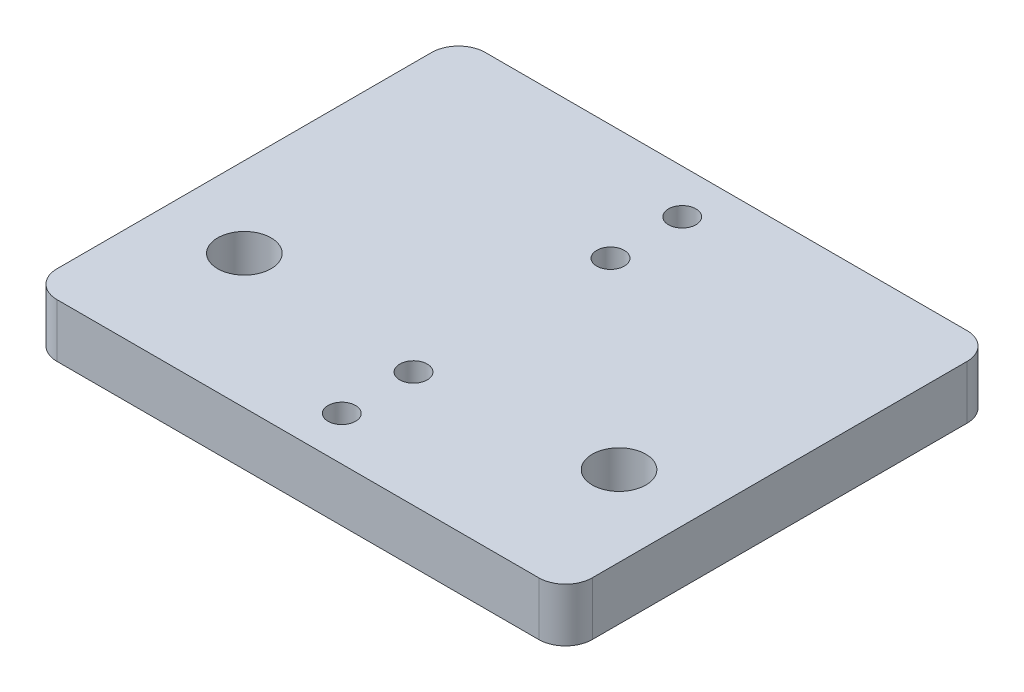
ISO-10303-21;
HEADER;
FILE_DESCRIPTION(('STEP AP214'),'2;1');
FILE_NAME('part.step','',(''),(''),'','','');
FILE_SCHEMA(('AUTOMOTIVE_DESIGN { 1 0 10303 214 1 1 1 1 }'));
ENDSEC;
DATA;
#1=APPLICATION_CONTEXT('core data for automotive mechanical design processes');
#2=APPLICATION_PROTOCOL_DEFINITION('international standard','automotive_design',2000,#1);
#3=PRODUCT_CONTEXT('',#1,'mechanical');
#4=PRODUCT('Part','Part','',(#3));
#5=PRODUCT_RELATED_PRODUCT_CATEGORY('part','',(#4));
#6=PRODUCT_DEFINITION_FORMATION('','',#4);
#7=PRODUCT_DEFINITION_CONTEXT('part definition',#1,'design');
#8=PRODUCT_DEFINITION('design','',#6,#7);
#9=PRODUCT_DEFINITION_SHAPE('','',#8);
#10=(LENGTH_UNIT() NAMED_UNIT(*) SI_UNIT(.MILLI.,.METRE.));
#11=(NAMED_UNIT(*) PLANE_ANGLE_UNIT() SI_UNIT($,.RADIAN.));
#12=(NAMED_UNIT(*) SI_UNIT($,.STERADIAN.) SOLID_ANGLE_UNIT());
#13=UNCERTAINTY_MEASURE_WITH_UNIT(LENGTH_MEASURE(1.E-05),#10,'distance_accuracy_value','');
#14=(GEOMETRIC_REPRESENTATION_CONTEXT(3) GLOBAL_UNCERTAINTY_ASSIGNED_CONTEXT((#13)) GLOBAL_UNIT_ASSIGNED_CONTEXT((#10,
#11,#12)) REPRESENTATION_CONTEXT('',''));
#15=CARTESIAN_POINT('',(0.,0.,0.));
#16=DIRECTION('',(0.,0.,1.));
#17=DIRECTION('',(1.,0.,0.));
#18=AXIS2_PLACEMENT_3D('',#15,#16,#17);
#19=CARTESIAN_POINT('',(0.,6.35,0.));
#20=DIRECTION('',(0.,-1.,0.));
#21=DIRECTION('',(0.,0.,-1.));
#22=AXIS2_PLACEMENT_3D('',#19,#20,#21);
#23=PLANE('',#22);
#24=DIRECTION('',(-1.,0.,0.));
#25=VECTOR('',#24,1.);
#26=CARTESIAN_POINT('',(-63.5,6.35,-50.8));
#27=LINE('',#26,#25);
#28=CARTESIAN_POINT('',(57.15,6.35,-50.8));
#29=VERTEX_POINT('',#28);
#30=CARTESIAN_POINT('',(-57.15,6.35,-50.8));
#31=VERTEX_POINT('',#30);
#32=EDGE_CURVE('E168',#29,#31,#27,.T.);
#33=ORIENTED_EDGE('',*,*,#32,.T.);
#34=CARTESIAN_POINT('',(-57.15,6.35,-44.45));
#35=DIRECTION('',(0.,-1.,0.));
#36=DIRECTION('',(0.,0.,-1.));
#37=AXIS2_PLACEMENT_3D('',#34,#35,#36);
#38=CIRCLE('',#37,6.35);
#39=CARTESIAN_POINT('',(-63.5,6.35,-44.45));
#40=VERTEX_POINT('',#39);
#41=EDGE_CURVE('E146',#31,#40,#38,.F.);
#42=ORIENTED_EDGE('',*,*,#41,.T.);
#43=DIRECTION('',(0.,0.,1.));
#44=VECTOR('',#43,1.);
#45=CARTESIAN_POINT('',(-63.5,6.35,50.8));
#46=LINE('',#45,#44);
#47=CARTESIAN_POINT('',(-63.5,6.35,44.45));
#48=VERTEX_POINT('',#47);
#49=EDGE_CURVE('E116',#40,#48,#46,.T.);
#50=ORIENTED_EDGE('',*,*,#49,.T.);
#51=CARTESIAN_POINT('',(-57.15,6.35,44.45));
#52=DIRECTION('',(0.,-1.,0.));
#53=DIRECTION('',(0.,0.,-1.));
#54=AXIS2_PLACEMENT_3D('',#51,#52,#53);
#55=CIRCLE('',#54,6.35);
#56=CARTESIAN_POINT('',(-57.15,6.35,50.8));
#57=VERTEX_POINT('',#56);
#58=EDGE_CURVE('E52',#48,#57,#55,.F.);
#59=ORIENTED_EDGE('',*,*,#58,.T.);
#60=DIRECTION('',(1.,0.,0.));
#61=VECTOR('',#60,1.);
#62=CARTESIAN_POINT('',(-63.5,6.35,50.8));
#63=LINE('',#62,#61);
#64=CARTESIAN_POINT('',(57.1499999999999,6.35,50.8));
#65=VERTEX_POINT('',#64);
#66=EDGE_CURVE('E132',#57,#65,#63,.T.);
#67=ORIENTED_EDGE('',*,*,#66,.T.);
#68=CARTESIAN_POINT('',(57.15,6.35,44.45));
#69=DIRECTION('',(0.,-1.,0.));
#70=DIRECTION('',(0.,0.,-1.));
#71=AXIS2_PLACEMENT_3D('',#68,#69,#70);
#72=CIRCLE('',#71,6.35);
#73=CARTESIAN_POINT('',(63.5,6.35,44.45));
#74=VERTEX_POINT('',#73);
#75=EDGE_CURVE('E142',#65,#74,#72,.F.);
#76=ORIENTED_EDGE('',*,*,#75,.T.);
#77=DIRECTION('',(0.,0.,-1.));
#78=VECTOR('',#77,1.);
#79=CARTESIAN_POINT('',(63.5,6.35,50.8));
#80=LINE('',#79,#78);
#81=CARTESIAN_POINT('',(63.5,6.35,-44.45));
#82=VERTEX_POINT('',#81);
#83=EDGE_CURVE('E126',#74,#82,#80,.T.);
#84=ORIENTED_EDGE('',*,*,#83,.T.);
#85=CARTESIAN_POINT('',(57.15,6.35,-44.45));
#86=DIRECTION('',(0.,-1.,0.));
#87=DIRECTION('',(0.,0.,-1.));
#88=AXIS2_PLACEMENT_3D('',#85,#86,#87);
#89=CIRCLE('',#88,6.35);
#90=EDGE_CURVE('E144',#82,#29,#89,.F.);
#91=ORIENTED_EDGE('',*,*,#90,.T.);
#92=EDGE_LOOP('',(#33,#42,#50,#59,#67,#76,#84,#91));
#93=FACE_BOUND('',#92,.T.);
#94=CARTESIAN_POINT('',(0.,6.35,-23.368));
#95=DIRECTION('',(0.,1.,0.));
#96=DIRECTION('',(0.,0.,1.));
#97=AXIS2_PLACEMENT_3D('',#94,#95,#96);
#98=CIRCLE('',#97,3.2639);
#99=CARTESIAN_POINT('',(0.,6.35,-20.1041));
#100=VERTEX_POINT('',#99);
#101=EDGE_CURVE('E177',#100,#100,#98,.T.);
#102=ORIENTED_EDGE('',*,*,#101,.F.);
#103=EDGE_LOOP('',(#102));
#104=FACE_BOUND('',#103,.T.);
#105=CARTESIAN_POINT('',(0.,6.35,-40.386));
#106=DIRECTION('',(0.,1.,0.));
#107=DIRECTION('',(0.,0.,1.));
#108=AXIS2_PLACEMENT_3D('',#105,#106,#107);
#109=CIRCLE('',#108,3.2639);
#110=CARTESIAN_POINT('',(0.,6.35,-37.1221));
#111=VERTEX_POINT('',#110);
#112=EDGE_CURVE('E182',#111,#111,#109,.T.);
#113=ORIENTED_EDGE('',*,*,#112,.F.);
#114=EDGE_LOOP('',(#113));
#115=FACE_BOUND('',#114,.T.);
#116=CARTESIAN_POINT('',(0.,6.35,23.368));
#117=DIRECTION('',(0.,1.,0.));
#118=DIRECTION('',(0.,0.,-1.));
#119=AXIS2_PLACEMENT_3D('',#116,#117,#118);
#120=CIRCLE('',#119,3.2639);
#121=CARTESIAN_POINT('',(0.,6.35,20.1041));
#122=VERTEX_POINT('',#121);
#123=EDGE_CURVE('E187',#122,#122,#120,.T.);
#124=ORIENTED_EDGE('',*,*,#123,.F.);
#125=EDGE_LOOP('',(#124));
#126=FACE_BOUND('',#125,.T.);
#127=CARTESIAN_POINT('',(0.,6.35,40.386));
#128=DIRECTION('',(0.,1.,0.));
#129=DIRECTION('',(0.,0.,-1.));
#130=AXIS2_PLACEMENT_3D('',#127,#128,#129);
#131=CIRCLE('',#130,3.2639);
#132=CARTESIAN_POINT('',(0.,6.35,37.1221));
#133=VERTEX_POINT('',#132);
#134=EDGE_CURVE('E193',#133,#133,#131,.T.);
#135=ORIENTED_EDGE('',*,*,#134,.F.);
#136=EDGE_LOOP('',(#135));
#137=FACE_BOUND('',#136,.T.);
#138=CARTESIAN_POINT('',(-44.45,6.35,19.05));
#139=DIRECTION('',(0.,1.,0.));
#140=DIRECTION('',(0.,0.,1.));
#141=AXIS2_PLACEMENT_3D('',#138,#139,#140);
#142=CIRCLE('',#141,6.35);
#143=CARTESIAN_POINT('',(-44.45,6.35,25.4));
#144=VERTEX_POINT('',#143);
#145=EDGE_CURVE('E199',#144,#144,#142,.T.);
#146=ORIENTED_EDGE('',*,*,#145,.F.);
#147=EDGE_LOOP('',(#146));
#148=FACE_BOUND('',#147,.T.);
#149=CARTESIAN_POINT('',(44.45,6.35,19.05));
#150=DIRECTION('',(0.,1.,0.));
#151=DIRECTION('',(0.,0.,1.));
#152=AXIS2_PLACEMENT_3D('',#149,#150,#151);
#153=CIRCLE('',#152,6.35);
#154=CARTESIAN_POINT('',(44.45,6.35,25.4));
#155=VERTEX_POINT('',#154);
#156=EDGE_CURVE('E205',#155,#155,#153,.T.);
#157=ORIENTED_EDGE('',*,*,#156,.F.);
#158=EDGE_LOOP('',(#157));
#159=FACE_BOUND('',#158,.T.);
#160=ADVANCED_FACE('F32',(#93,#104,#115,#126,#137,#148,#159),#23,.F.);
#161=CARTESIAN_POINT('',(0.,-6.35,0.));
#162=DIRECTION('',(0.,-1.,0.));
#163=DIRECTION('',(0.,0.,-1.));
#164=AXIS2_PLACEMENT_3D('',#161,#162,#163);
#165=PLANE('',#164);
#166=CARTESIAN_POINT('',(-44.45,-6.35,19.05));
#167=DIRECTION('',(0.,1.,0.));
#168=DIRECTION('',(0.,0.,1.));
#169=AXIS2_PLACEMENT_3D('',#166,#167,#168);
#170=CIRCLE('',#169,6.35);
#171=CARTESIAN_POINT('',(-44.45,-6.35,25.4));
#172=VERTEX_POINT('',#171);
#173=EDGE_CURVE('E202',#172,#172,#170,.T.);
#174=ORIENTED_EDGE('',*,*,#173,.T.);
#175=EDGE_LOOP('',(#174));
#176=FACE_BOUND('',#175,.T.);
#177=CARTESIAN_POINT('',(0.,-6.35,23.368));
#178=DIRECTION('',(0.,1.,0.));
#179=DIRECTION('',(0.,0.,-1.));
#180=AXIS2_PLACEMENT_3D('',#177,#178,#179);
#181=CIRCLE('',#180,3.2639);
#182=CARTESIAN_POINT('',(0.,-6.35,20.1041));
#183=VERTEX_POINT('',#182);
#184=EDGE_CURVE('E190',#183,#183,#181,.T.);
#185=ORIENTED_EDGE('',*,*,#184,.T.);
#186=EDGE_LOOP('',(#185));
#187=FACE_BOUND('',#186,.T.);
#188=CARTESIAN_POINT('',(0.,-6.35,-23.368));
#189=DIRECTION('',(0.,1.,0.));
#190=DIRECTION('',(0.,0.,1.));
#191=AXIS2_PLACEMENT_3D('',#188,#189,#190);
#192=CIRCLE('',#191,3.2639);
#193=CARTESIAN_POINT('',(0.,-6.35,-20.1041));
#194=VERTEX_POINT('',#193);
#195=EDGE_CURVE('E173',#194,#194,#192,.T.);
#196=ORIENTED_EDGE('',*,*,#195,.T.);
#197=EDGE_LOOP('',(#196));
#198=FACE_BOUND('',#197,.T.);
#199=DIRECTION('',(0.,0.,1.));
#200=VECTOR('',#199,1.);
#201=CARTESIAN_POINT('',(-63.5,-6.35,50.8));
#202=LINE('',#201,#200);
#203=CARTESIAN_POINT('',(-63.5,-6.35,-44.45));
#204=VERTEX_POINT('',#203);
#205=CARTESIAN_POINT('',(-63.5,-6.35,44.45));
#206=VERTEX_POINT('',#205);
#207=EDGE_CURVE('E114',#204,#206,#202,.T.);
#208=ORIENTED_EDGE('',*,*,#207,.F.);
#209=CARTESIAN_POINT('',(-57.15,-6.35,-44.45));
#210=DIRECTION('',(0.,-1.,0.));
#211=DIRECTION('',(0.,0.,-1.));
#212=AXIS2_PLACEMENT_3D('',#209,#210,#211);
#213=CIRCLE('',#212,6.35);
#214=CARTESIAN_POINT('',(-57.15,-6.35,-50.8));
#215=VERTEX_POINT('',#214);
#216=EDGE_CURVE('E97',#204,#215,#213,.T.);
#217=ORIENTED_EDGE('',*,*,#216,.T.);
#218=DIRECTION('',(-1.,0.,0.));
#219=VECTOR('',#218,1.);
#220=CARTESIAN_POINT('',(-63.5,-6.35,-50.8));
#221=LINE('',#220,#219);
#222=CARTESIAN_POINT('',(57.15,-6.35,-50.8));
#223=VERTEX_POINT('',#222);
#224=EDGE_CURVE('E124',#223,#215,#221,.T.);
#225=ORIENTED_EDGE('',*,*,#224,.F.);
#226=CARTESIAN_POINT('',(57.15,-6.35,-44.45));
#227=DIRECTION('',(0.,-1.,0.));
#228=DIRECTION('',(0.,0.,-1.));
#229=AXIS2_PLACEMENT_3D('',#226,#227,#228);
#230=CIRCLE('',#229,6.35);
#231=CARTESIAN_POINT('',(63.5,-6.35,-44.45));
#232=VERTEX_POINT('',#231);
#233=EDGE_CURVE('E108',#223,#232,#230,.T.);
#234=ORIENTED_EDGE('',*,*,#233,.T.);
#235=DIRECTION('',(0.,0.,-1.));
#236=VECTOR('',#235,1.);
#237=CARTESIAN_POINT('',(63.5,-6.35,50.8));
#238=LINE('',#237,#236);
#239=CARTESIAN_POINT('',(63.5,-6.35,44.45));
#240=VERTEX_POINT('',#239);
#241=EDGE_CURVE('E128',#240,#232,#238,.T.);
#242=ORIENTED_EDGE('',*,*,#241,.F.);
#243=CARTESIAN_POINT('',(57.15,-6.35,44.45));
#244=DIRECTION('',(0.,-1.,0.));
#245=DIRECTION('',(0.,0.,-1.));
#246=AXIS2_PLACEMENT_3D('',#243,#244,#245);
#247=CIRCLE('',#246,6.35);
#248=CARTESIAN_POINT('',(57.1499999999999,-6.35,50.8));
#249=VERTEX_POINT('',#248);
#250=EDGE_CURVE('E135',#240,#249,#247,.T.);
#251=ORIENTED_EDGE('',*,*,#250,.T.);
#252=DIRECTION('',(1.,0.,0.));
#253=VECTOR('',#252,1.);
#254=CARTESIAN_POINT('',(-63.5,-6.35,50.8));
#255=LINE('',#254,#253);
#256=CARTESIAN_POINT('',(-57.15,-6.35,50.8));
#257=VERTEX_POINT('',#256);
#258=EDGE_CURVE('E123',#257,#249,#255,.T.);
#259=ORIENTED_EDGE('',*,*,#258,.F.);
#260=CARTESIAN_POINT('',(-57.15,-6.35,44.45));
#261=DIRECTION('',(0.,-1.,0.));
#262=DIRECTION('',(0.,0.,-1.));
#263=AXIS2_PLACEMENT_3D('',#260,#261,#262);
#264=CIRCLE('',#263,6.35);
#265=EDGE_CURVE('E117',#257,#206,#264,.T.);
#266=ORIENTED_EDGE('',*,*,#265,.T.);
#267=EDGE_LOOP('',(#208,#217,#225,#234,#242,#251,#259,#266));
#268=FACE_BOUND('',#267,.T.);
#269=CARTESIAN_POINT('',(0.,-6.35,-40.386));
#270=DIRECTION('',(0.,1.,0.));
#271=DIRECTION('',(0.,0.,1.));
#272=AXIS2_PLACEMENT_3D('',#269,#270,#271);
#273=CIRCLE('',#272,3.2639);
#274=CARTESIAN_POINT('',(0.,-6.35,-37.1221));
#275=VERTEX_POINT('',#274);
#276=EDGE_CURVE('E184',#275,#275,#273,.T.);
#277=ORIENTED_EDGE('',*,*,#276,.T.);
#278=EDGE_LOOP('',(#277));
#279=FACE_BOUND('',#278,.T.);
#280=CARTESIAN_POINT('',(0.,-6.35,40.386));
#281=DIRECTION('',(0.,1.,0.));
#282=DIRECTION('',(0.,0.,-1.));
#283=AXIS2_PLACEMENT_3D('',#280,#281,#282);
#284=CIRCLE('',#283,3.2639);
#285=CARTESIAN_POINT('',(0.,-6.35,37.1221));
#286=VERTEX_POINT('',#285);
#287=EDGE_CURVE('E196',#286,#286,#284,.T.);
#288=ORIENTED_EDGE('',*,*,#287,.T.);
#289=EDGE_LOOP('',(#288));
#290=FACE_BOUND('',#289,.T.);
#291=CARTESIAN_POINT('',(44.45,-6.35,19.05));
#292=DIRECTION('',(0.,1.,0.));
#293=DIRECTION('',(0.,0.,1.));
#294=AXIS2_PLACEMENT_3D('',#291,#292,#293);
#295=CIRCLE('',#294,6.35);
#296=CARTESIAN_POINT('',(44.45,-6.35,25.4));
#297=VERTEX_POINT('',#296);
#298=EDGE_CURVE('E208',#297,#297,#295,.T.);
#299=ORIENTED_EDGE('',*,*,#298,.T.);
#300=EDGE_LOOP('',(#299));
#301=FACE_BOUND('',#300,.T.);
#302=ADVANCED_FACE('F120',(#176,#187,#198,#268,#279,#290,#301),#165,.T.);
#303=CARTESIAN_POINT('',(63.5,6.35,50.8));
#304=DIRECTION('',(-1.,0.,0.));
#305=DIRECTION('',(0.,0.,1.));
#306=AXIS2_PLACEMENT_3D('',#303,#304,#305);
#307=PLANE('',#306);
#308=ORIENTED_EDGE('',*,*,#241,.T.);
#309=DIRECTION('',(0.,-1.,0.));
#310=VECTOR('',#309,1.);
#311=CARTESIAN_POINT('',(63.5,6.35,-44.45));
#312=LINE('',#311,#310);
#313=EDGE_CURVE('E151',#232,#82,#312,.F.);
#314=ORIENTED_EDGE('',*,*,#313,.T.);
#315=ORIENTED_EDGE('',*,*,#83,.F.);
#316=DIRECTION('',(0.,-1.,0.));
#317=VECTOR('',#316,1.);
#318=CARTESIAN_POINT('',(63.5,6.35,44.45));
#319=LINE('',#318,#317);
#320=EDGE_CURVE('E148',#74,#240,#319,.T.);
#321=ORIENTED_EDGE('',*,*,#320,.T.);
#322=EDGE_LOOP('',(#308,#314,#315,#321));
#323=FACE_BOUND('',#322,.T.);
#324=ADVANCED_FACE('F164',(#323),#307,.F.);
#325=CARTESIAN_POINT('',(-63.5,6.35,-50.8));
#326=DIRECTION('',(0.,0.,1.));
#327=DIRECTION('',(1.,0.,0.));
#328=AXIS2_PLACEMENT_3D('',#325,#326,#327);
#329=PLANE('',#328);
#330=ORIENTED_EDGE('',*,*,#224,.T.);
#331=DIRECTION('',(0.,-1.,0.));
#332=VECTOR('',#331,1.);
#333=CARTESIAN_POINT('',(-57.15,6.35,-50.8));
#334=LINE('',#333,#332);
#335=EDGE_CURVE('E102',#215,#31,#334,.F.);
#336=ORIENTED_EDGE('',*,*,#335,.T.);
#337=ORIENTED_EDGE('',*,*,#32,.F.);
#338=DIRECTION('',(0.,-1.,0.));
#339=VECTOR('',#338,1.);
#340=CARTESIAN_POINT('',(57.15,6.35,-50.8));
#341=LINE('',#340,#339);
#342=EDGE_CURVE('E107',#29,#223,#341,.T.);
#343=ORIENTED_EDGE('',*,*,#342,.T.);
#344=EDGE_LOOP('',(#330,#336,#337,#343));
#345=FACE_BOUND('',#344,.T.);
#346=ADVANCED_FACE('F233',(#345),#329,.F.);
#347=CARTESIAN_POINT('',(-63.5,6.35,50.8));
#348=DIRECTION('',(1.,0.,0.));
#349=DIRECTION('',(0.,0.,-1.));
#350=AXIS2_PLACEMENT_3D('',#347,#348,#349);
#351=PLANE('',#350);
#352=ORIENTED_EDGE('',*,*,#49,.F.);
#353=DIRECTION('',(0.,-1.,0.));
#354=VECTOR('',#353,1.);
#355=CARTESIAN_POINT('',(-63.5,6.35,-44.45));
#356=LINE('',#355,#354);
#357=EDGE_CURVE('E101',#40,#204,#356,.T.);
#358=ORIENTED_EDGE('',*,*,#357,.T.);
#359=ORIENTED_EDGE('',*,*,#207,.T.);
#360=DIRECTION('',(0.,-1.,0.));
#361=VECTOR('',#360,1.);
#362=CARTESIAN_POINT('',(-63.5,6.35,44.45));
#363=LINE('',#362,#361);
#364=EDGE_CURVE('E118',#206,#48,#363,.F.);
#365=ORIENTED_EDGE('',*,*,#364,.T.);
#366=EDGE_LOOP('',(#352,#358,#359,#365));
#367=FACE_BOUND('',#366,.T.);
#368=ADVANCED_FACE('F113',(#367),#351,.F.);
#369=CARTESIAN_POINT('',(-63.5,6.35,50.8));
#370=DIRECTION('',(0.,0.,-1.));
#371=DIRECTION('',(-1.,0.,0.));
#372=AXIS2_PLACEMENT_3D('',#369,#370,#371);
#373=PLANE('',#372);
#374=ORIENTED_EDGE('',*,*,#258,.T.);
#375=DIRECTION('',(0.,-1.,0.));
#376=VECTOR('',#375,1.);
#377=CARTESIAN_POINT('',(57.15,6.35,50.8));
#378=LINE('',#377,#376);
#379=EDGE_CURVE('E11',#249,#65,#378,.F.);
#380=ORIENTED_EDGE('',*,*,#379,.T.);
#381=ORIENTED_EDGE('',*,*,#66,.F.);
#382=DIRECTION('',(0.,-1.,0.));
#383=VECTOR('',#382,1.);
#384=CARTESIAN_POINT('',(-57.15,6.35,50.8));
#385=LINE('',#384,#383);
#386=EDGE_CURVE('E40',#57,#257,#385,.T.);
#387=ORIENTED_EDGE('',*,*,#386,.T.);
#388=EDGE_LOOP('',(#374,#380,#381,#387));
#389=FACE_BOUND('',#388,.T.);
#390=ADVANCED_FACE('F154',(#389),#373,.F.);
#391=CARTESIAN_POINT('',(0.,6.35,-23.368));
#392=DIRECTION('',(0.,-1.,0.));
#393=DIRECTION('',(0.,0.,-1.));
#394=AXIS2_PLACEMENT_3D('',#391,#392,#393);
#395=CYLINDRICAL_SURFACE('',#394,3.2639);
#396=ORIENTED_EDGE('',*,*,#101,.T.);
#397=EDGE_LOOP('',(#396));
#398=FACE_BOUND('',#397,.T.);
#399=ORIENTED_EDGE('',*,*,#195,.F.);
#400=EDGE_LOOP('',(#399));
#401=FACE_BOUND('',#400,.T.);
#402=ADVANCED_FACE('F226',(#398,#401),#395,.F.);
#403=CARTESIAN_POINT('',(0.,6.35,-40.386));
#404=DIRECTION('',(0.,-1.,0.));
#405=DIRECTION('',(0.,0.,-1.));
#406=AXIS2_PLACEMENT_3D('',#403,#404,#405);
#407=CYLINDRICAL_SURFACE('',#406,3.2639);
#408=ORIENTED_EDGE('',*,*,#112,.T.);
#409=EDGE_LOOP('',(#408));
#410=FACE_BOUND('',#409,.T.);
#411=ORIENTED_EDGE('',*,*,#276,.F.);
#412=EDGE_LOOP('',(#411));
#413=FACE_BOUND('',#412,.T.);
#414=ADVANCED_FACE('F342',(#410,#413),#407,.F.);
#415=CARTESIAN_POINT('',(0.,6.35,23.368));
#416=DIRECTION('',(0.,-1.,0.));
#417=DIRECTION('',(0.,0.,-1.));
#418=AXIS2_PLACEMENT_3D('',#415,#416,#417);
#419=CYLINDRICAL_SURFACE('',#418,3.2639);
#420=ORIENTED_EDGE('',*,*,#123,.T.);
#421=EDGE_LOOP('',(#420));
#422=FACE_BOUND('',#421,.T.);
#423=ORIENTED_EDGE('',*,*,#184,.F.);
#424=EDGE_LOOP('',(#423));
#425=FACE_BOUND('',#424,.T.);
#426=ADVANCED_FACE('F332',(#422,#425),#419,.F.);
#427=CARTESIAN_POINT('',(0.,6.35,40.386));
#428=DIRECTION('',(0.,-1.,0.));
#429=DIRECTION('',(0.,0.,-1.));
#430=AXIS2_PLACEMENT_3D('',#427,#428,#429);
#431=CYLINDRICAL_SURFACE('',#430,3.2639);
#432=ORIENTED_EDGE('',*,*,#134,.T.);
#433=EDGE_LOOP('',(#432));
#434=FACE_BOUND('',#433,.T.);
#435=ORIENTED_EDGE('',*,*,#287,.F.);
#436=EDGE_LOOP('',(#435));
#437=FACE_BOUND('',#436,.T.);
#438=ADVANCED_FACE('F322',(#434,#437),#431,.F.);
#439=CARTESIAN_POINT('',(-44.45,6.35,19.05));
#440=DIRECTION('',(0.,-1.,0.));
#441=DIRECTION('',(0.,0.,-1.));
#442=AXIS2_PLACEMENT_3D('',#439,#440,#441);
#443=CYLINDRICAL_SURFACE('',#442,6.35);
#444=ORIENTED_EDGE('',*,*,#145,.T.);
#445=EDGE_LOOP('',(#444));
#446=FACE_BOUND('',#445,.T.);
#447=ORIENTED_EDGE('',*,*,#173,.F.);
#448=EDGE_LOOP('',(#447));
#449=FACE_BOUND('',#448,.T.);
#450=ADVANCED_FACE('F313',(#446,#449),#443,.F.);
#451=CARTESIAN_POINT('',(44.45,6.35,19.05));
#452=DIRECTION('',(0.,-1.,0.));
#453=DIRECTION('',(0.,0.,-1.));
#454=AXIS2_PLACEMENT_3D('',#451,#452,#453);
#455=CYLINDRICAL_SURFACE('',#454,6.35);
#456=ORIENTED_EDGE('',*,*,#156,.T.);
#457=EDGE_LOOP('',(#456));
#458=FACE_BOUND('',#457,.T.);
#459=ORIENTED_EDGE('',*,*,#298,.F.);
#460=EDGE_LOOP('',(#459));
#461=FACE_BOUND('',#460,.T.);
#462=ADVANCED_FACE('F214',(#458,#461),#455,.F.);
#463=CARTESIAN_POINT('',(-57.15,6.35,-44.45));
#464=DIRECTION('',(0.,-1.,0.));
#465=DIRECTION('',(0.,0.,-1.));
#466=AXIS2_PLACEMENT_3D('',#463,#464,#465);
#467=CYLINDRICAL_SURFACE('',#466,6.35);
#468=ORIENTED_EDGE('',*,*,#41,.F.);
#469=ORIENTED_EDGE('',*,*,#335,.F.);
#470=ORIENTED_EDGE('',*,*,#216,.F.);
#471=ORIENTED_EDGE('',*,*,#357,.F.);
#472=EDGE_LOOP('',(#468,#469,#470,#471));
#473=FACE_BOUND('',#472,.T.);
#474=ADVANCED_FACE('F100',(#473),#467,.T.);
#475=CARTESIAN_POINT('',(57.15,6.35,-44.45));
#476=DIRECTION('',(0.,-1.,0.));
#477=DIRECTION('',(0.,0.,-1.));
#478=AXIS2_PLACEMENT_3D('',#475,#476,#477);
#479=CYLINDRICAL_SURFACE('',#478,6.35);
#480=ORIENTED_EDGE('',*,*,#90,.F.);
#481=ORIENTED_EDGE('',*,*,#313,.F.);
#482=ORIENTED_EDGE('',*,*,#233,.F.);
#483=ORIENTED_EDGE('',*,*,#342,.F.);
#484=EDGE_LOOP('',(#480,#481,#482,#483));
#485=FACE_BOUND('',#484,.T.);
#486=ADVANCED_FACE('F241',(#485),#479,.T.);
#487=CARTESIAN_POINT('',(57.15,6.35,44.45));
#488=DIRECTION('',(0.,-1.,0.));
#489=DIRECTION('',(0.,0.,-1.));
#490=AXIS2_PLACEMENT_3D('',#487,#488,#489);
#491=CYLINDRICAL_SURFACE('',#490,6.35);
#492=ORIENTED_EDGE('',*,*,#75,.F.);
#493=ORIENTED_EDGE('',*,*,#379,.F.);
#494=ORIENTED_EDGE('',*,*,#250,.F.);
#495=ORIENTED_EDGE('',*,*,#320,.F.);
#496=EDGE_LOOP('',(#492,#493,#494,#495));
#497=FACE_BOUND('',#496,.T.);
#498=ADVANCED_FACE('F161',(#497),#491,.T.);
#499=CARTESIAN_POINT('',(-57.15,6.35,44.45));
#500=DIRECTION('',(0.,-1.,0.));
#501=DIRECTION('',(0.,0.,-1.));
#502=AXIS2_PLACEMENT_3D('',#499,#500,#501);
#503=CYLINDRICAL_SURFACE('',#502,6.35);
#504=ORIENTED_EDGE('',*,*,#58,.F.);
#505=ORIENTED_EDGE('',*,*,#364,.F.);
#506=ORIENTED_EDGE('',*,*,#265,.F.);
#507=ORIENTED_EDGE('',*,*,#386,.F.);
#508=EDGE_LOOP('',(#504,#505,#506,#507));
#509=FACE_BOUND('',#508,.T.);
#510=ADVANCED_FACE('F34',(#509),#503,.T.);
#511=CLOSED_SHELL('',(#160,#302,#324,#346,#368,#390,#402,#414,#426,#438,#450,#462,#474,#486,
#498,#510));
#512=MANIFOLD_SOLID_BREP('B2',#511);
#513=ADVANCED_BREP_SHAPE_REPRESENTATION('',(#18,#512),#14);
#514=SHAPE_DEFINITION_REPRESENTATION(#9,#513);
ENDSEC;
END-ISO-10303-21;
